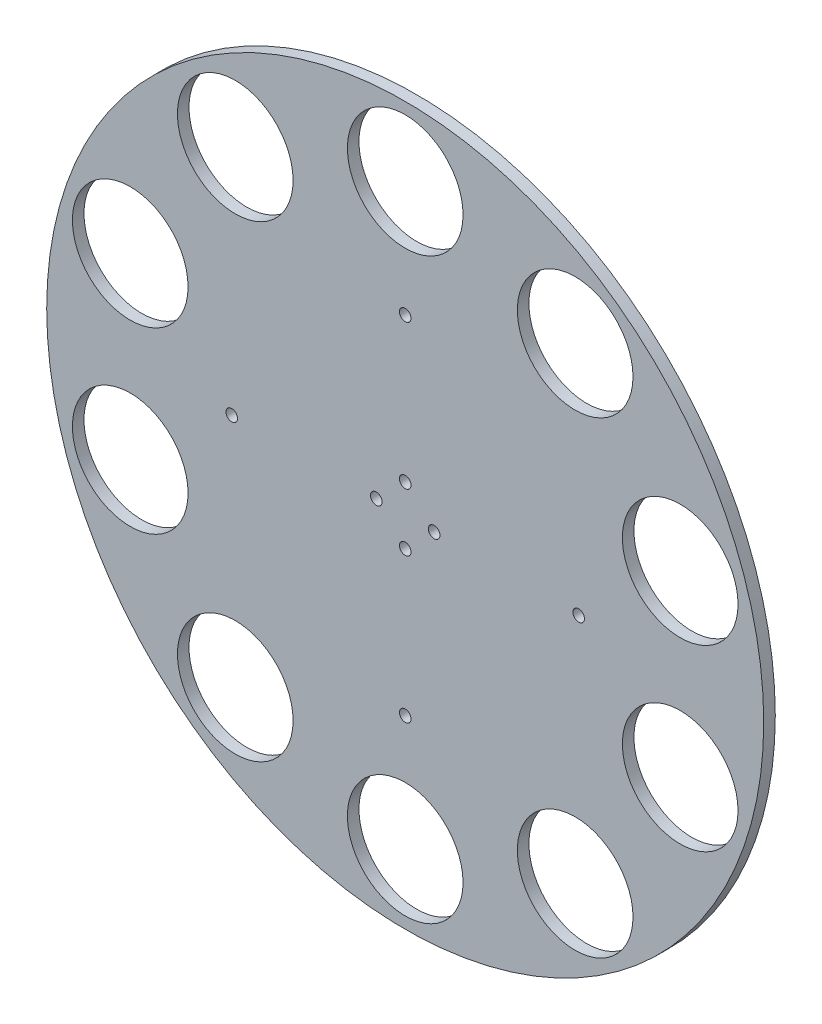
ISO-10303-21;
HEADER;
FILE_DESCRIPTION(('STEP AP214'),'2;1');
FILE_NAME('part.step','',(''),(''),'','','');
FILE_SCHEMA(('AUTOMOTIVE_DESIGN { 1 0 10303 214 1 1 1 1 }'));
ENDSEC;
DATA;
#1=APPLICATION_CONTEXT('core data for automotive mechanical design processes');
#2=APPLICATION_PROTOCOL_DEFINITION('international standard','automotive_design',2000,#1);
#3=PRODUCT_CONTEXT('',#1,'mechanical');
#4=PRODUCT('Part','Part','',(#3));
#5=PRODUCT_RELATED_PRODUCT_CATEGORY('part','',(#4));
#6=PRODUCT_DEFINITION_FORMATION('','',#4);
#7=PRODUCT_DEFINITION_CONTEXT('part definition',#1,'design');
#8=PRODUCT_DEFINITION('design','',#6,#7);
#9=PRODUCT_DEFINITION_SHAPE('','',#8);
#10=(LENGTH_UNIT() NAMED_UNIT(*) SI_UNIT(.MILLI.,.METRE.));
#11=(NAMED_UNIT(*) PLANE_ANGLE_UNIT() SI_UNIT($,.RADIAN.));
#12=(NAMED_UNIT(*) SI_UNIT($,.STERADIAN.) SOLID_ANGLE_UNIT());
#13=UNCERTAINTY_MEASURE_WITH_UNIT(LENGTH_MEASURE(1.E-05),#10,'distance_accuracy_value','');
#14=(GEOMETRIC_REPRESENTATION_CONTEXT(3) GLOBAL_UNCERTAINTY_ASSIGNED_CONTEXT((#13)) GLOBAL_UNIT_ASSIGNED_CONTEXT((#10,
#11,#12)) REPRESENTATION_CONTEXT('',''));
#15=CARTESIAN_POINT('',(0.,0.,0.));
#16=DIRECTION('',(0.,0.,1.));
#17=DIRECTION('',(1.,0.,0.));
#18=AXIS2_PLACEMENT_3D('',#15,#16,#17);
#19=CARTESIAN_POINT('',(0.,0.,0.));
#20=DIRECTION('',(0.,0.,1.));
#21=DIRECTION('',(1.,0.,0.));
#22=AXIS2_PLACEMENT_3D('',#19,#20,#21);
#23=PLANE('',#22);
#24=CARTESIAN_POINT('',(12.5,0.,0.));
#25=DIRECTION('',(0.,0.,-1.));
#26=DIRECTION('',(-1.,0.,0.));
#27=AXIS2_PLACEMENT_3D('',#24,#25,#26);
#28=CIRCLE('',#27,2.5);
#29=CARTESIAN_POINT('',(15.,0.,0.));
#30=VERTEX_POINT('',#29);
#31=EDGE_CURVE('E194',#30,#30,#28,.T.);
#32=ORIENTED_EDGE('',*,*,#31,.F.);
#33=EDGE_LOOP('',(#32));
#34=FACE_BOUND('',#33,.T.);
#35=CARTESIAN_POINT('',(0.,-12.5,0.));
#36=DIRECTION('',(0.,0.,-1.));
#37=DIRECTION('',(-1.,0.,0.));
#38=AXIS2_PLACEMENT_3D('',#35,#36,#37);
#39=CIRCLE('',#38,2.5);
#40=CARTESIAN_POINT('',(2.5,-12.5,0.));
#41=VERTEX_POINT('',#40);
#42=EDGE_CURVE('E217',#41,#41,#39,.T.);
#43=ORIENTED_EDGE('',*,*,#42,.F.);
#44=EDGE_LOOP('',(#43));
#45=FACE_BOUND('',#44,.T.);
#46=CARTESIAN_POINT('',(-12.5,0.,0.));
#47=DIRECTION('',(0.,0.,-1.));
#48=DIRECTION('',(-1.,0.,0.));
#49=AXIS2_PLACEMENT_3D('',#46,#47,#48);
#50=CIRCLE('',#49,2.5);
#51=CARTESIAN_POINT('',(-10.,0.,0.));
#52=VERTEX_POINT('',#51);
#53=EDGE_CURVE('E228',#52,#52,#50,.T.);
#54=ORIENTED_EDGE('',*,*,#53,.F.);
#55=EDGE_LOOP('',(#54));
#56=FACE_BOUND('',#55,.T.);
#57=CARTESIAN_POINT('',(0.,12.5,0.));
#58=DIRECTION('',(0.,0.,-1.));
#59=DIRECTION('',(-1.,0.,0.));
#60=AXIS2_PLACEMENT_3D('',#57,#58,#59);
#61=CIRCLE('',#60,2.5);
#62=CARTESIAN_POINT('',(2.5,12.5,0.));
#63=VERTEX_POINT('',#62);
#64=EDGE_CURVE('E239',#63,#63,#61,.T.);
#65=ORIENTED_EDGE('',*,*,#64,.F.);
#66=EDGE_LOOP('',(#65));
#67=FACE_BOUND('',#66,.T.);
#68=CARTESIAN_POINT('',(-118.882064536894,-38.6271242968684,0.));
#69=DIRECTION('',(0.,0.,-1.));
#70=DIRECTION('',(-1.,0.,0.));
#71=AXIS2_PLACEMENT_3D('',#68,#69,#70);
#72=CIRCLE('',#71,25.);
#73=CARTESIAN_POINT('',(-93.8820645368942,-38.6271242968684,0.));
#74=VERTEX_POINT('',#73);
#75=EDGE_CURVE('E249',#74,#74,#72,.T.);
#76=ORIENTED_EDGE('',*,*,#75,.F.);
#77=EDGE_LOOP('',(#76));
#78=FACE_BOUND('',#77,.T.);
#79=CARTESIAN_POINT('',(75.,0.,0.));
#80=DIRECTION('',(0.,0.,-1.));
#81=DIRECTION('',(-1.,0.,0.));
#82=AXIS2_PLACEMENT_3D('',#79,#80,#81);
#83=CIRCLE('',#82,2.5);
#84=CARTESIAN_POINT('',(77.5,0.,0.));
#85=VERTEX_POINT('',#84);
#86=EDGE_CURVE('E264',#85,#85,#83,.T.);
#87=ORIENTED_EDGE('',*,*,#86,.F.);
#88=EDGE_LOOP('',(#87));
#89=FACE_BOUND('',#88,.T.);
#90=CARTESIAN_POINT('',(0.,-75.,0.));
#91=DIRECTION('',(0.,0.,-1.));
#92=DIRECTION('',(-1.,0.,0.));
#93=AXIS2_PLACEMENT_3D('',#90,#91,#92);
#94=CIRCLE('',#93,2.5);
#95=CARTESIAN_POINT('',(2.5,-75.,0.));
#96=VERTEX_POINT('',#95);
#97=EDGE_CURVE('E277',#96,#96,#94,.T.);
#98=ORIENTED_EDGE('',*,*,#97,.F.);
#99=EDGE_LOOP('',(#98));
#100=FACE_BOUND('',#99,.T.);
#101=CARTESIAN_POINT('',(-75.,0.,0.));
#102=DIRECTION('',(0.,0.,-1.));
#103=DIRECTION('',(-1.,0.,0.));
#104=AXIS2_PLACEMENT_3D('',#101,#102,#103);
#105=CIRCLE('',#104,2.5);
#106=CARTESIAN_POINT('',(-72.5,0.,0.));
#107=VERTEX_POINT('',#106);
#108=EDGE_CURVE('E290',#107,#107,#105,.T.);
#109=ORIENTED_EDGE('',*,*,#108,.F.);
#110=EDGE_LOOP('',(#109));
#111=FACE_BOUND('',#110,.T.);
#112=CARTESIAN_POINT('',(0.,75.,0.));
#113=DIRECTION('',(0.,0.,-1.));
#114=DIRECTION('',(-1.,0.,0.));
#115=AXIS2_PLACEMENT_3D('',#112,#113,#114);
#116=CIRCLE('',#115,2.5);
#117=CARTESIAN_POINT('',(2.5,75.,0.));
#118=VERTEX_POINT('',#117);
#119=EDGE_CURVE('E297',#118,#118,#116,.T.);
#120=ORIENTED_EDGE('',*,*,#119,.F.);
#121=EDGE_LOOP('',(#120));
#122=FACE_BOUND('',#121,.T.);
#123=CARTESIAN_POINT('',(-73.4731565365592,-101.127124296868,0.));
#124=DIRECTION('',(0.,0.,-1.));
#125=DIRECTION('',(-1.,0.,0.));
#126=AXIS2_PLACEMENT_3D('',#123,#124,#125);
#127=CIRCLE('',#126,25.);
#128=CARTESIAN_POINT('',(-48.4731565365592,-101.127124296868,0.));
#129=VERTEX_POINT('',#128);
#130=EDGE_CURVE('E310',#129,#129,#127,.T.);
#131=ORIENTED_EDGE('',*,*,#130,.F.);
#132=EDGE_LOOP('',(#131));
#133=FACE_BOUND('',#132,.T.);
#134=CARTESIAN_POINT('',(-118.882064536894,38.6271242968684,0.));
#135=DIRECTION('',(0.,0.,-1.));
#136=DIRECTION('',(-1.,0.,0.));
#137=AXIS2_PLACEMENT_3D('',#134,#135,#136);
#138=CIRCLE('',#137,25.);
#139=CARTESIAN_POINT('',(-93.8820645368942,38.6271242968685,0.));
#140=VERTEX_POINT('',#139);
#141=EDGE_CURVE('E319',#140,#140,#138,.T.);
#142=ORIENTED_EDGE('',*,*,#141,.F.);
#143=EDGE_LOOP('',(#142));
#144=FACE_BOUND('',#143,.T.);
#145=CARTESIAN_POINT('',(-73.4731565365591,101.127124296868,0.));
#146=DIRECTION('',(0.,0.,-1.));
#147=DIRECTION('',(-1.,0.,0.));
#148=AXIS2_PLACEMENT_3D('',#145,#146,#147);
#149=CIRCLE('',#148,25.);
#150=CARTESIAN_POINT('',(-48.4731565365591,101.127124296868,0.));
#151=VERTEX_POINT('',#150);
#152=EDGE_CURVE('E332',#151,#151,#149,.T.);
#153=ORIENTED_EDGE('',*,*,#152,.F.);
#154=EDGE_LOOP('',(#153));
#155=FACE_BOUND('',#154,.T.);
#156=CARTESIAN_POINT('',(0.,125.,0.));
#157=DIRECTION('',(0.,0.,-1.));
#158=DIRECTION('',(-1.,0.,0.));
#159=AXIS2_PLACEMENT_3D('',#156,#157,#158);
#160=CIRCLE('',#159,25.);
#161=CARTESIAN_POINT('',(25.,125.,0.));
#162=VERTEX_POINT('',#161);
#163=EDGE_CURVE('E345',#162,#162,#160,.T.);
#164=ORIENTED_EDGE('',*,*,#163,.F.);
#165=EDGE_LOOP('',(#164));
#166=FACE_BOUND('',#165,.T.);
#167=CARTESIAN_POINT('',(73.4731565365591,101.127124296868,0.));
#168=DIRECTION('',(0.,0.,-1.));
#169=DIRECTION('',(-1.,0.,0.));
#170=AXIS2_PLACEMENT_3D('',#167,#168,#169);
#171=CIRCLE('',#170,25.);
#172=CARTESIAN_POINT('',(98.4731565365591,101.127124296868,0.));
#173=VERTEX_POINT('',#172);
#174=EDGE_CURVE('E359',#173,#173,#171,.T.);
#175=ORIENTED_EDGE('',*,*,#174,.F.);
#176=EDGE_LOOP('',(#175));
#177=FACE_BOUND('',#176,.T.);
#178=CARTESIAN_POINT('',(118.882064536894,38.6271242968684,0.));
#179=DIRECTION('',(0.,0.,-1.));
#180=DIRECTION('',(-1.,0.,0.));
#181=AXIS2_PLACEMENT_3D('',#178,#179,#180);
#182=CIRCLE('',#181,25.);
#183=CARTESIAN_POINT('',(143.882064536894,38.6271242968684,0.));
#184=VERTEX_POINT('',#183);
#185=EDGE_CURVE('E369',#184,#184,#182,.T.);
#186=ORIENTED_EDGE('',*,*,#185,.F.);
#187=EDGE_LOOP('',(#186));
#188=FACE_BOUND('',#187,.T.);
#189=CARTESIAN_POINT('',(118.882064536894,-38.6271242968684,0.));
#190=DIRECTION('',(0.,0.,-1.));
#191=DIRECTION('',(-1.,0.,0.));
#192=AXIS2_PLACEMENT_3D('',#189,#190,#191);
#193=CIRCLE('',#192,25.);
#194=CARTESIAN_POINT('',(143.882064536894,-38.6271242968684,0.));
#195=VERTEX_POINT('',#194);
#196=EDGE_CURVE('E260',#195,#195,#193,.T.);
#197=ORIENTED_EDGE('',*,*,#196,.F.);
#198=EDGE_LOOP('',(#197));
#199=FACE_BOUND('',#198,.T.);
#200=CARTESIAN_POINT('',(73.4731565365591,-101.127124296868,0.));
#201=DIRECTION('',(0.,0.,-1.));
#202=DIRECTION('',(-1.,0.,0.));
#203=AXIS2_PLACEMENT_3D('',#200,#201,#202);
#204=CIRCLE('',#203,25.);
#205=CARTESIAN_POINT('',(98.4731565365591,-101.127124296868,0.));
#206=VERTEX_POINT('',#205);
#207=EDGE_CURVE('E202',#206,#206,#204,.T.);
#208=ORIENTED_EDGE('',*,*,#207,.F.);
#209=EDGE_LOOP('',(#208));
#210=FACE_BOUND('',#209,.T.);
#211=CARTESIAN_POINT('',(0.,-125.,0.));
#212=DIRECTION('',(0.,0.,-1.));
#213=DIRECTION('',(-1.,0.,0.));
#214=AXIS2_PLACEMENT_3D('',#211,#212,#213);
#215=CIRCLE('',#214,25.);
#216=CARTESIAN_POINT('',(25.,-125.,0.));
#217=VERTEX_POINT('',#216);
#218=EDGE_CURVE('E343',#217,#217,#215,.T.);
#219=ORIENTED_EDGE('',*,*,#218,.F.);
#220=EDGE_LOOP('',(#219));
#221=FACE_BOUND('',#220,.T.);
#222=CARTESIAN_POINT('',(0.,0.,0.));
#223=DIRECTION('',(0.,0.,1.));
#224=DIRECTION('',(1.,0.,0.));
#225=AXIS2_PLACEMENT_3D('',#222,#223,#224);
#226=CIRCLE('',#225,155.);
#227=CARTESIAN_POINT('',(-155.,0.,0.));
#228=VERTEX_POINT('',#227);
#229=EDGE_CURVE('E11',#228,#228,#226,.T.);
#230=ORIENTED_EDGE('',*,*,#229,.F.);
#231=EDGE_LOOP('',(#230));
#232=FACE_BOUND('',#231,.T.);
#233=ADVANCED_FACE('F17',(#34,#45,#56,#67,#78,#89,#100,#111,#122,#133,#144,#155,#166,#177,#188,
#199,#210,#221,#232),#23,.F.);
#234=CARTESIAN_POINT('',(0.,0.,5.));
#235=DIRECTION('',(0.,0.,1.));
#236=DIRECTION('',(1.,0.,0.));
#237=AXIS2_PLACEMENT_3D('',#234,#235,#236);
#238=PLANE('',#237);
#239=CARTESIAN_POINT('',(12.5,0.,5.));
#240=DIRECTION('',(0.,0.,-1.));
#241=DIRECTION('',(-1.,0.,0.));
#242=AXIS2_PLACEMENT_3D('',#239,#240,#241);
#243=CIRCLE('',#242,2.5);
#244=CARTESIAN_POINT('',(15.,0.,5.));
#245=VERTEX_POINT('',#244);
#246=EDGE_CURVE('E192',#245,#245,#243,.T.);
#247=ORIENTED_EDGE('',*,*,#246,.T.);
#248=EDGE_LOOP('',(#247));
#249=FACE_BOUND('',#248,.T.);
#250=CARTESIAN_POINT('',(0.,-12.5,5.));
#251=DIRECTION('',(0.,0.,-1.));
#252=DIRECTION('',(-1.,0.,0.));
#253=AXIS2_PLACEMENT_3D('',#250,#251,#252);
#254=CIRCLE('',#253,2.5);
#255=CARTESIAN_POINT('',(2.5,-12.5,5.));
#256=VERTEX_POINT('',#255);
#257=EDGE_CURVE('E209',#256,#256,#254,.T.);
#258=ORIENTED_EDGE('',*,*,#257,.T.);
#259=EDGE_LOOP('',(#258));
#260=FACE_BOUND('',#259,.T.);
#261=CARTESIAN_POINT('',(-12.5,0.,5.));
#262=DIRECTION('',(0.,0.,-1.));
#263=DIRECTION('',(-1.,0.,0.));
#264=AXIS2_PLACEMENT_3D('',#261,#262,#263);
#265=CIRCLE('',#264,2.5);
#266=CARTESIAN_POINT('',(-10.,0.,5.));
#267=VERTEX_POINT('',#266);
#268=EDGE_CURVE('E222',#267,#267,#265,.T.);
#269=ORIENTED_EDGE('',*,*,#268,.T.);
#270=EDGE_LOOP('',(#269));
#271=FACE_BOUND('',#270,.T.);
#272=CARTESIAN_POINT('',(0.,12.5,5.));
#273=DIRECTION('',(0.,0.,-1.));
#274=DIRECTION('',(-1.,0.,0.));
#275=AXIS2_PLACEMENT_3D('',#272,#273,#274);
#276=CIRCLE('',#275,2.5);
#277=CARTESIAN_POINT('',(2.5,12.5,5.));
#278=VERTEX_POINT('',#277);
#279=EDGE_CURVE('E235',#278,#278,#276,.T.);
#280=ORIENTED_EDGE('',*,*,#279,.T.);
#281=EDGE_LOOP('',(#280));
#282=FACE_BOUND('',#281,.T.);
#283=CARTESIAN_POINT('',(-118.882064536894,-38.6271242968684,5.));
#284=DIRECTION('',(0.,0.,-1.));
#285=DIRECTION('',(-1.,0.,0.));
#286=AXIS2_PLACEMENT_3D('',#283,#284,#285);
#287=CIRCLE('',#286,25.);
#288=CARTESIAN_POINT('',(-93.8820645368942,-38.6271242968684,5.));
#289=VERTEX_POINT('',#288);
#290=EDGE_CURVE('E242',#289,#289,#287,.T.);
#291=ORIENTED_EDGE('',*,*,#290,.T.);
#292=EDGE_LOOP('',(#291));
#293=FACE_BOUND('',#292,.T.);
#294=CARTESIAN_POINT('',(75.,0.,5.));
#295=DIRECTION('',(0.,0.,-1.));
#296=DIRECTION('',(-1.,0.,0.));
#297=AXIS2_PLACEMENT_3D('',#294,#295,#296);
#298=CIRCLE('',#297,2.5);
#299=CARTESIAN_POINT('',(77.5,0.,5.));
#300=VERTEX_POINT('',#299);
#301=EDGE_CURVE('E253',#300,#300,#298,.T.);
#302=ORIENTED_EDGE('',*,*,#301,.T.);
#303=EDGE_LOOP('',(#302));
#304=FACE_BOUND('',#303,.T.);
#305=CARTESIAN_POINT('',(0.,-75.,5.));
#306=DIRECTION('',(0.,0.,-1.));
#307=DIRECTION('',(-1.,0.,0.));
#308=AXIS2_PLACEMENT_3D('',#305,#306,#307);
#309=CIRCLE('',#308,2.5);
#310=CARTESIAN_POINT('',(2.5,-75.,5.));
#311=VERTEX_POINT('',#310);
#312=EDGE_CURVE('E268',#311,#311,#309,.T.);
#313=ORIENTED_EDGE('',*,*,#312,.T.);
#314=EDGE_LOOP('',(#313));
#315=FACE_BOUND('',#314,.T.);
#316=CARTESIAN_POINT('',(-75.,0.,5.));
#317=DIRECTION('',(0.,0.,-1.));
#318=DIRECTION('',(-1.,0.,0.));
#319=AXIS2_PLACEMENT_3D('',#316,#317,#318);
#320=CIRCLE('',#319,2.5);
#321=CARTESIAN_POINT('',(-72.5,0.,5.));
#322=VERTEX_POINT('',#321);
#323=EDGE_CURVE('E276',#322,#322,#320,.T.);
#324=ORIENTED_EDGE('',*,*,#323,.T.);
#325=EDGE_LOOP('',(#324));
#326=FACE_BOUND('',#325,.T.);
#327=CARTESIAN_POINT('',(0.,75.,5.));
#328=DIRECTION('',(0.,0.,-1.));
#329=DIRECTION('',(-1.,0.,0.));
#330=AXIS2_PLACEMENT_3D('',#327,#328,#329);
#331=CIRCLE('',#330,2.5);
#332=CARTESIAN_POINT('',(2.5,75.,5.));
#333=VERTEX_POINT('',#332);
#334=EDGE_CURVE('E289',#333,#333,#331,.T.);
#335=ORIENTED_EDGE('',*,*,#334,.T.);
#336=EDGE_LOOP('',(#335));
#337=FACE_BOUND('',#336,.T.);
#338=CARTESIAN_POINT('',(-73.4731565365592,-101.127124296868,5.));
#339=DIRECTION('',(0.,0.,-1.));
#340=DIRECTION('',(-1.,0.,0.));
#341=AXIS2_PLACEMENT_3D('',#338,#339,#340);
#342=CIRCLE('',#341,25.);
#343=CARTESIAN_POINT('',(-48.4731565365592,-101.127124296868,5.));
#344=VERTEX_POINT('',#343);
#345=EDGE_CURVE('E302',#344,#344,#342,.T.);
#346=ORIENTED_EDGE('',*,*,#345,.T.);
#347=EDGE_LOOP('',(#346));
#348=FACE_BOUND('',#347,.T.);
#349=CARTESIAN_POINT('',(-118.882064536894,38.6271242968684,5.));
#350=DIRECTION('',(0.,0.,-1.));
#351=DIRECTION('',(-1.,0.,0.));
#352=AXIS2_PLACEMENT_3D('',#349,#350,#351);
#353=CIRCLE('',#352,25.);
#354=CARTESIAN_POINT('',(-93.8820645368942,38.6271242968685,5.));
#355=VERTEX_POINT('',#354);
#356=EDGE_CURVE('E315',#355,#355,#353,.T.);
#357=ORIENTED_EDGE('',*,*,#356,.T.);
#358=EDGE_LOOP('',(#357));
#359=FACE_BOUND('',#358,.T.);
#360=CARTESIAN_POINT('',(-73.4731565365591,101.127124296868,5.));
#361=DIRECTION('',(0.,0.,-1.));
#362=DIRECTION('',(-1.,0.,0.));
#363=AXIS2_PLACEMENT_3D('',#360,#361,#362);
#364=CIRCLE('',#363,25.);
#365=CARTESIAN_POINT('',(-48.4731565365591,101.127124296868,5.));
#366=VERTEX_POINT('',#365);
#367=EDGE_CURVE('E323',#366,#366,#364,.T.);
#368=ORIENTED_EDGE('',*,*,#367,.T.);
#369=EDGE_LOOP('',(#368));
#370=FACE_BOUND('',#369,.T.);
#371=CARTESIAN_POINT('',(0.,125.,5.));
#372=DIRECTION('',(0.,0.,-1.));
#373=DIRECTION('',(-1.,0.,0.));
#374=AXIS2_PLACEMENT_3D('',#371,#372,#373);
#375=CIRCLE('',#374,25.);
#376=CARTESIAN_POINT('',(25.,125.,5.));
#377=VERTEX_POINT('',#376);
#378=EDGE_CURVE('E331',#377,#377,#375,.T.);
#379=ORIENTED_EDGE('',*,*,#378,.T.);
#380=EDGE_LOOP('',(#379));
#381=FACE_BOUND('',#380,.T.);
#382=CARTESIAN_POINT('',(73.4731565365591,101.127124296868,5.));
#383=DIRECTION('',(0.,0.,-1.));
#384=DIRECTION('',(-1.,0.,0.));
#385=AXIS2_PLACEMENT_3D('',#382,#383,#384);
#386=CIRCLE('',#385,25.);
#387=CARTESIAN_POINT('',(98.4731565365591,101.127124296868,5.));
#388=VERTEX_POINT('',#387);
#389=EDGE_CURVE('E349',#388,#388,#386,.T.);
#390=ORIENTED_EDGE('',*,*,#389,.T.);
#391=EDGE_LOOP('',(#390));
#392=FACE_BOUND('',#391,.T.);
#393=CARTESIAN_POINT('',(118.882064536894,38.6271242968684,5.));
#394=DIRECTION('',(0.,0.,-1.));
#395=DIRECTION('',(-1.,0.,0.));
#396=AXIS2_PLACEMENT_3D('',#393,#394,#395);
#397=CIRCLE('',#396,25.);
#398=CARTESIAN_POINT('',(143.882064536894,38.6271242968684,5.));
#399=VERTEX_POINT('',#398);
#400=EDGE_CURVE('E363',#399,#399,#397,.T.);
#401=ORIENTED_EDGE('',*,*,#400,.T.);
#402=EDGE_LOOP('',(#401));
#403=FACE_BOUND('',#402,.T.);
#404=CARTESIAN_POINT('',(118.882064536894,-38.6271242968684,5.));
#405=DIRECTION('',(0.,0.,-1.));
#406=DIRECTION('',(-1.,0.,0.));
#407=AXIS2_PLACEMENT_3D('',#404,#405,#406);
#408=CIRCLE('',#407,25.);
#409=CARTESIAN_POINT('',(143.882064536894,-38.6271242968684,5.));
#410=VERTEX_POINT('',#409);
#411=EDGE_CURVE('E375',#410,#410,#408,.T.);
#412=ORIENTED_EDGE('',*,*,#411,.T.);
#413=EDGE_LOOP('',(#412));
#414=FACE_BOUND('',#413,.T.);
#415=CARTESIAN_POINT('',(73.4731565365591,-101.127124296868,5.));
#416=DIRECTION('',(0.,0.,-1.));
#417=DIRECTION('',(-1.,0.,0.));
#418=AXIS2_PLACEMENT_3D('',#415,#416,#417);
#419=CIRCLE('',#418,25.);
#420=CARTESIAN_POINT('',(98.4731565365591,-101.127124296868,5.));
#421=VERTEX_POINT('',#420);
#422=EDGE_CURVE('E252',#421,#421,#419,.T.);
#423=ORIENTED_EDGE('',*,*,#422,.T.);
#424=EDGE_LOOP('',(#423));
#425=FACE_BOUND('',#424,.T.);
#426=CARTESIAN_POINT('',(0.,-125.,5.));
#427=DIRECTION('',(0.,0.,-1.));
#428=DIRECTION('',(-1.,0.,0.));
#429=AXIS2_PLACEMENT_3D('',#426,#427,#428);
#430=CIRCLE('',#429,25.);
#431=CARTESIAN_POINT('',(25.,-125.,5.));
#432=VERTEX_POINT('',#431);
#433=EDGE_CURVE('E384',#432,#432,#430,.T.);
#434=ORIENTED_EDGE('',*,*,#433,.T.);
#435=EDGE_LOOP('',(#434));
#436=FACE_BOUND('',#435,.T.);
#437=CARTESIAN_POINT('',(0.,0.,5.));
#438=DIRECTION('',(0.,0.,1.));
#439=DIRECTION('',(1.,0.,0.));
#440=AXIS2_PLACEMENT_3D('',#437,#438,#439);
#441=CIRCLE('',#440,155.);
#442=CARTESIAN_POINT('',(-155.,0.,5.));
#443=VERTEX_POINT('',#442);
#444=EDGE_CURVE('E350',#443,#443,#441,.T.);
#445=ORIENTED_EDGE('',*,*,#444,.T.);
#446=EDGE_LOOP('',(#445));
#447=FACE_BOUND('',#446,.T.);
#448=ADVANCED_FACE('F197',(#249,#260,#271,#282,#293,#304,#315,#326,#337,#348,#359,#370,#381,
#392,#403,#414,#425,#436,#447),#238,.T.);
#449=CARTESIAN_POINT('',(0.,0.,0.));
#450=DIRECTION('',(0.,0.,1.));
#451=DIRECTION('',(1.,0.,0.));
#452=AXIS2_PLACEMENT_3D('',#449,#450,#451);
#453=CYLINDRICAL_SURFACE('',#452,155.);
#454=ORIENTED_EDGE('',*,*,#444,.F.);
#455=DIRECTION('',(0.,0.,-1.));
#456=VECTOR('',#455,1.);
#457=CARTESIAN_POINT('',(-155.,0.,0.));
#458=LINE('',#457,#456);
#459=EDGE_CURVE('E25',#443,#228,#458,.T.);
#460=ORIENTED_EDGE('',*,*,#459,.T.);
#461=ORIENTED_EDGE('',*,*,#229,.T.);
#462=ORIENTED_EDGE('',*,*,#459,.F.);
#463=EDGE_LOOP('',(#454,#460,#461,#462));
#464=FACE_BOUND('',#463,.T.);
#465=ADVANCED_FACE('F396',(#464),#453,.T.);
#466=CARTESIAN_POINT('',(0.,-125.,0.));
#467=DIRECTION('',(0.,0.,1.));
#468=DIRECTION('',(-1.,0.,0.));
#469=AXIS2_PLACEMENT_3D('',#466,#467,#468);
#470=CYLINDRICAL_SURFACE('',#469,25.);
#471=ORIENTED_EDGE('',*,*,#433,.F.);
#472=DIRECTION('',(0.,0.,-1.));
#473=VECTOR('',#472,1.);
#474=CARTESIAN_POINT('',(25.,-125.,0.));
#475=LINE('',#474,#473);
#476=EDGE_CURVE('E346',#432,#217,#475,.T.);
#477=ORIENTED_EDGE('',*,*,#476,.T.);
#478=ORIENTED_EDGE('',*,*,#218,.T.);
#479=ORIENTED_EDGE('',*,*,#476,.F.);
#480=EDGE_LOOP('',(#471,#477,#478,#479));
#481=FACE_BOUND('',#480,.T.);
#482=ADVANCED_FACE('F402',(#481),#470,.F.);
#483=CARTESIAN_POINT('',(73.4731565365591,-101.127124296868,0.));
#484=DIRECTION('',(0.,0.,1.));
#485=DIRECTION('',(-1.,0.,0.));
#486=AXIS2_PLACEMENT_3D('',#483,#484,#485);
#487=CYLINDRICAL_SURFACE('',#486,25.);
#488=ORIENTED_EDGE('',*,*,#422,.F.);
#489=DIRECTION('',(0.,0.,-1.));
#490=VECTOR('',#489,1.);
#491=CARTESIAN_POINT('',(98.4731565365591,-101.127124296868,0.));
#492=LINE('',#491,#490);
#493=EDGE_CURVE('E258',#421,#206,#492,.T.);
#494=ORIENTED_EDGE('',*,*,#493,.T.);
#495=ORIENTED_EDGE('',*,*,#207,.T.);
#496=ORIENTED_EDGE('',*,*,#493,.F.);
#497=EDGE_LOOP('',(#488,#494,#495,#496));
#498=FACE_BOUND('',#497,.T.);
#499=ADVANCED_FACE('F409',(#498),#487,.F.);
#500=CARTESIAN_POINT('',(118.882064536894,-38.6271242968684,0.));
#501=DIRECTION('',(0.,0.,1.));
#502=DIRECTION('',(-1.,0.,0.));
#503=AXIS2_PLACEMENT_3D('',#500,#501,#502);
#504=CYLINDRICAL_SURFACE('',#503,25.);
#505=ORIENTED_EDGE('',*,*,#411,.F.);
#506=DIRECTION('',(0.,0.,-1.));
#507=VECTOR('',#506,1.);
#508=CARTESIAN_POINT('',(143.882064536894,-38.6271242968684,0.));
#509=LINE('',#508,#507);
#510=EDGE_CURVE('E376',#410,#195,#509,.T.);
#511=ORIENTED_EDGE('',*,*,#510,.T.);
#512=ORIENTED_EDGE('',*,*,#196,.T.);
#513=ORIENTED_EDGE('',*,*,#510,.F.);
#514=EDGE_LOOP('',(#505,#511,#512,#513));
#515=FACE_BOUND('',#514,.T.);
#516=ADVANCED_FACE('F411',(#515),#504,.F.);
#517=CARTESIAN_POINT('',(118.882064536894,38.6271242968684,0.));
#518=DIRECTION('',(0.,0.,1.));
#519=DIRECTION('',(-1.,0.,0.));
#520=AXIS2_PLACEMENT_3D('',#517,#518,#519);
#521=CYLINDRICAL_SURFACE('',#520,25.);
#522=ORIENTED_EDGE('',*,*,#400,.F.);
#523=DIRECTION('',(0.,0.,-1.));
#524=VECTOR('',#523,1.);
#525=CARTESIAN_POINT('',(143.882064536894,38.6271242968684,0.));
#526=LINE('',#525,#524);
#527=EDGE_CURVE('E364',#399,#184,#526,.T.);
#528=ORIENTED_EDGE('',*,*,#527,.T.);
#529=ORIENTED_EDGE('',*,*,#185,.T.);
#530=ORIENTED_EDGE('',*,*,#527,.F.);
#531=EDGE_LOOP('',(#522,#528,#529,#530));
#532=FACE_BOUND('',#531,.T.);
#533=ADVANCED_FACE('F416',(#532),#521,.F.);
#534=CARTESIAN_POINT('',(73.4731565365591,101.127124296868,0.));
#535=DIRECTION('',(0.,0.,1.));
#536=DIRECTION('',(-1.,0.,0.));
#537=AXIS2_PLACEMENT_3D('',#534,#535,#536);
#538=CYLINDRICAL_SURFACE('',#537,25.);
#539=ORIENTED_EDGE('',*,*,#389,.F.);
#540=DIRECTION('',(0.,0.,-1.));
#541=VECTOR('',#540,1.);
#542=CARTESIAN_POINT('',(98.4731565365591,101.127124296868,0.));
#543=LINE('',#542,#541);
#544=EDGE_CURVE('E353',#388,#173,#543,.T.);
#545=ORIENTED_EDGE('',*,*,#544,.T.);
#546=ORIENTED_EDGE('',*,*,#174,.T.);
#547=ORIENTED_EDGE('',*,*,#544,.F.);
#548=EDGE_LOOP('',(#539,#545,#546,#547));
#549=FACE_BOUND('',#548,.T.);
#550=ADVANCED_FACE('F425',(#549),#538,.F.);
#551=CARTESIAN_POINT('',(0.,125.,0.));
#552=DIRECTION('',(0.,0.,1.));
#553=DIRECTION('',(-1.,0.,0.));
#554=AXIS2_PLACEMENT_3D('',#551,#552,#553);
#555=CYLINDRICAL_SURFACE('',#554,25.);
#556=ORIENTED_EDGE('',*,*,#378,.F.);
#557=DIRECTION('',(0.,0.,-1.));
#558=VECTOR('',#557,1.);
#559=CARTESIAN_POINT('',(25.,125.,0.));
#560=LINE('',#559,#558);
#561=EDGE_CURVE('E339',#377,#162,#560,.T.);
#562=ORIENTED_EDGE('',*,*,#561,.T.);
#563=ORIENTED_EDGE('',*,*,#163,.T.);
#564=ORIENTED_EDGE('',*,*,#561,.F.);
#565=EDGE_LOOP('',(#556,#562,#563,#564));
#566=FACE_BOUND('',#565,.T.);
#567=ADVANCED_FACE('F428',(#566),#555,.F.);
#568=CARTESIAN_POINT('',(-73.4731565365591,101.127124296868,0.));
#569=DIRECTION('',(0.,0.,1.));
#570=DIRECTION('',(-1.,0.,0.));
#571=AXIS2_PLACEMENT_3D('',#568,#569,#570);
#572=CYLINDRICAL_SURFACE('',#571,25.);
#573=ORIENTED_EDGE('',*,*,#367,.F.);
#574=DIRECTION('',(0.,0.,-1.));
#575=VECTOR('',#574,1.);
#576=CARTESIAN_POINT('',(-48.4731565365591,101.127124296868,0.));
#577=LINE('',#576,#575);
#578=EDGE_CURVE('E330',#366,#151,#577,.T.);
#579=ORIENTED_EDGE('',*,*,#578,.T.);
#580=ORIENTED_EDGE('',*,*,#152,.T.);
#581=ORIENTED_EDGE('',*,*,#578,.F.);
#582=EDGE_LOOP('',(#573,#579,#580,#581));
#583=FACE_BOUND('',#582,.T.);
#584=ADVANCED_FACE('F424',(#583),#572,.F.);
#585=CARTESIAN_POINT('',(-118.882064536894,38.6271242968684,0.));
#586=DIRECTION('',(0.,0.,1.));
#587=DIRECTION('',(-1.,0.,0.));
#588=AXIS2_PLACEMENT_3D('',#585,#586,#587);
#589=CYLINDRICAL_SURFACE('',#588,25.);
#590=ORIENTED_EDGE('',*,*,#356,.F.);
#591=DIRECTION('',(0.,0.,-1.));
#592=VECTOR('',#591,1.);
#593=CARTESIAN_POINT('',(-93.8820645368942,38.6271242968685,0.));
#594=LINE('',#593,#592);
#595=EDGE_CURVE('E316',#355,#140,#594,.T.);
#596=ORIENTED_EDGE('',*,*,#595,.T.);
#597=ORIENTED_EDGE('',*,*,#141,.T.);
#598=ORIENTED_EDGE('',*,*,#595,.F.);
#599=EDGE_LOOP('',(#590,#596,#597,#598));
#600=FACE_BOUND('',#599,.T.);
#601=ADVANCED_FACE('F430',(#600),#589,.F.);
#602=CARTESIAN_POINT('',(-73.4731565365592,-101.127124296868,0.));
#603=DIRECTION('',(0.,0.,1.));
#604=DIRECTION('',(-1.,0.,0.));
#605=AXIS2_PLACEMENT_3D('',#602,#603,#604);
#606=CYLINDRICAL_SURFACE('',#605,25.);
#607=ORIENTED_EDGE('',*,*,#345,.F.);
#608=DIRECTION('',(0.,0.,-1.));
#609=VECTOR('',#608,1.);
#610=CARTESIAN_POINT('',(-48.4731565365592,-101.127124296868,0.));
#611=LINE('',#610,#609);
#612=EDGE_CURVE('E303',#344,#129,#611,.T.);
#613=ORIENTED_EDGE('',*,*,#612,.T.);
#614=ORIENTED_EDGE('',*,*,#130,.T.);
#615=ORIENTED_EDGE('',*,*,#612,.F.);
#616=EDGE_LOOP('',(#607,#613,#614,#615));
#617=FACE_BOUND('',#616,.T.);
#618=ADVANCED_FACE('F435',(#617),#606,.F.);
#619=CARTESIAN_POINT('',(0.,75.,0.));
#620=DIRECTION('',(0.,0.,1.));
#621=DIRECTION('',(-1.,0.,0.));
#622=AXIS2_PLACEMENT_3D('',#619,#620,#621);
#623=CYLINDRICAL_SURFACE('',#622,2.5);
#624=ORIENTED_EDGE('',*,*,#334,.F.);
#625=DIRECTION('',(0.,0.,-1.));
#626=VECTOR('',#625,1.);
#627=CARTESIAN_POINT('',(2.5,75.,0.));
#628=LINE('',#627,#626);
#629=EDGE_CURVE('E292',#333,#118,#628,.T.);
#630=ORIENTED_EDGE('',*,*,#629,.T.);
#631=ORIENTED_EDGE('',*,*,#119,.T.);
#632=ORIENTED_EDGE('',*,*,#629,.F.);
#633=EDGE_LOOP('',(#624,#630,#631,#632));
#634=FACE_BOUND('',#633,.T.);
#635=ADVANCED_FACE('F436',(#634),#623,.F.);
#636=CARTESIAN_POINT('',(-75.,0.,0.));
#637=DIRECTION('',(0.,0.,1.));
#638=DIRECTION('',(-1.,0.,0.));
#639=AXIS2_PLACEMENT_3D('',#636,#637,#638);
#640=CYLINDRICAL_SURFACE('',#639,2.5);
#641=ORIENTED_EDGE('',*,*,#323,.F.);
#642=DIRECTION('',(0.,0.,-1.));
#643=VECTOR('',#642,1.);
#644=CARTESIAN_POINT('',(-72.5,0.,0.));
#645=LINE('',#644,#643);
#646=EDGE_CURVE('E284',#322,#107,#645,.T.);
#647=ORIENTED_EDGE('',*,*,#646,.T.);
#648=ORIENTED_EDGE('',*,*,#108,.T.);
#649=ORIENTED_EDGE('',*,*,#646,.F.);
#650=EDGE_LOOP('',(#641,#647,#648,#649));
#651=FACE_BOUND('',#650,.T.);
#652=ADVANCED_FACE('F442',(#651),#640,.F.);
#653=CARTESIAN_POINT('',(0.,-75.,0.));
#654=DIRECTION('',(0.,0.,1.));
#655=DIRECTION('',(-1.,0.,0.));
#656=AXIS2_PLACEMENT_3D('',#653,#654,#655);
#657=CYLINDRICAL_SURFACE('',#656,2.5);
#658=ORIENTED_EDGE('',*,*,#312,.F.);
#659=DIRECTION('',(0.,0.,-1.));
#660=VECTOR('',#659,1.);
#661=CARTESIAN_POINT('',(2.5,-75.,0.));
#662=LINE('',#661,#660);
#663=EDGE_CURVE('E275',#311,#96,#662,.T.);
#664=ORIENTED_EDGE('',*,*,#663,.T.);
#665=ORIENTED_EDGE('',*,*,#97,.T.);
#666=ORIENTED_EDGE('',*,*,#663,.F.);
#667=EDGE_LOOP('',(#658,#664,#665,#666));
#668=FACE_BOUND('',#667,.T.);
#669=ADVANCED_FACE('F441',(#668),#657,.F.);
#670=CARTESIAN_POINT('',(75.,0.,0.));
#671=DIRECTION('',(0.,0.,1.));
#672=DIRECTION('',(-1.,0.,0.));
#673=AXIS2_PLACEMENT_3D('',#670,#671,#672);
#674=CYLINDRICAL_SURFACE('',#673,2.5);
#675=ORIENTED_EDGE('',*,*,#301,.F.);
#676=DIRECTION('',(0.,0.,-1.));
#677=VECTOR('',#676,1.);
#678=CARTESIAN_POINT('',(77.5,0.,0.));
#679=LINE('',#678,#677);
#680=EDGE_CURVE('E261',#300,#85,#679,.T.);
#681=ORIENTED_EDGE('',*,*,#680,.T.);
#682=ORIENTED_EDGE('',*,*,#86,.T.);
#683=ORIENTED_EDGE('',*,*,#680,.F.);
#684=EDGE_LOOP('',(#675,#681,#682,#683));
#685=FACE_BOUND('',#684,.T.);
#686=ADVANCED_FACE('F453',(#685),#674,.F.);
#687=CARTESIAN_POINT('',(-118.882064536894,-38.6271242968684,0.));
#688=DIRECTION('',(0.,0.,1.));
#689=DIRECTION('',(-1.,0.,0.));
#690=AXIS2_PLACEMENT_3D('',#687,#688,#689);
#691=CYLINDRICAL_SURFACE('',#690,25.);
#692=ORIENTED_EDGE('',*,*,#290,.F.);
#693=DIRECTION('',(0.,0.,-1.));
#694=VECTOR('',#693,1.);
#695=CARTESIAN_POINT('',(-93.8820645368942,-38.6271242968684,0.));
#696=LINE('',#695,#694);
#697=EDGE_CURVE('E250',#289,#74,#696,.T.);
#698=ORIENTED_EDGE('',*,*,#697,.T.);
#699=ORIENTED_EDGE('',*,*,#75,.T.);
#700=ORIENTED_EDGE('',*,*,#697,.F.);
#701=EDGE_LOOP('',(#692,#698,#699,#700));
#702=FACE_BOUND('',#701,.T.);
#703=ADVANCED_FACE('F448',(#702),#691,.F.);
#704=CARTESIAN_POINT('',(0.,12.5,0.));
#705=DIRECTION('',(0.,0.,1.));
#706=DIRECTION('',(-1.,0.,0.));
#707=AXIS2_PLACEMENT_3D('',#704,#705,#706);
#708=CYLINDRICAL_SURFACE('',#707,2.5);
#709=ORIENTED_EDGE('',*,*,#279,.F.);
#710=DIRECTION('',(0.,0.,-1.));
#711=VECTOR('',#710,1.);
#712=CARTESIAN_POINT('',(2.5,12.5,0.));
#713=LINE('',#712,#711);
#714=EDGE_CURVE('E240',#278,#63,#713,.T.);
#715=ORIENTED_EDGE('',*,*,#714,.T.);
#716=ORIENTED_EDGE('',*,*,#64,.T.);
#717=ORIENTED_EDGE('',*,*,#714,.F.);
#718=EDGE_LOOP('',(#709,#715,#716,#717));
#719=FACE_BOUND('',#718,.T.);
#720=ADVANCED_FACE('F455',(#719),#708,.F.);
#721=CARTESIAN_POINT('',(-12.5,0.,0.));
#722=DIRECTION('',(0.,0.,1.));
#723=DIRECTION('',(-1.,0.,0.));
#724=AXIS2_PLACEMENT_3D('',#721,#722,#723);
#725=CYLINDRICAL_SURFACE('',#724,2.5);
#726=ORIENTED_EDGE('',*,*,#268,.F.);
#727=DIRECTION('',(0.,0.,-1.));
#728=VECTOR('',#727,1.);
#729=CARTESIAN_POINT('',(-10.,0.,0.));
#730=LINE('',#729,#728);
#731=EDGE_CURVE('E223',#267,#52,#730,.T.);
#732=ORIENTED_EDGE('',*,*,#731,.T.);
#733=ORIENTED_EDGE('',*,*,#53,.T.);
#734=ORIENTED_EDGE('',*,*,#731,.F.);
#735=EDGE_LOOP('',(#726,#732,#733,#734));
#736=FACE_BOUND('',#735,.T.);
#737=ADVANCED_FACE('F459',(#736),#725,.F.);
#738=CARTESIAN_POINT('',(0.,-12.5,0.));
#739=DIRECTION('',(0.,0.,1.));
#740=DIRECTION('',(-1.,0.,0.));
#741=AXIS2_PLACEMENT_3D('',#738,#739,#740);
#742=CYLINDRICAL_SURFACE('',#741,2.5);
#743=ORIENTED_EDGE('',*,*,#257,.F.);
#744=DIRECTION('',(0.,0.,-1.));
#745=VECTOR('',#744,1.);
#746=CARTESIAN_POINT('',(2.5,-12.5,0.));
#747=LINE('',#746,#745);
#748=EDGE_CURVE('E212',#256,#41,#747,.T.);
#749=ORIENTED_EDGE('',*,*,#748,.T.);
#750=ORIENTED_EDGE('',*,*,#42,.T.);
#751=ORIENTED_EDGE('',*,*,#748,.F.);
#752=EDGE_LOOP('',(#743,#749,#750,#751));
#753=FACE_BOUND('',#752,.T.);
#754=ADVANCED_FACE('F470',(#753),#742,.F.);
#755=CARTESIAN_POINT('',(12.5,0.,0.));
#756=DIRECTION('',(0.,0.,1.));
#757=DIRECTION('',(-1.,0.,0.));
#758=AXIS2_PLACEMENT_3D('',#755,#756,#757);
#759=CYLINDRICAL_SURFACE('',#758,2.5);
#760=ORIENTED_EDGE('',*,*,#246,.F.);
#761=DIRECTION('',(0.,0.,-1.));
#762=VECTOR('',#761,1.);
#763=CARTESIAN_POINT('',(15.,0.,0.));
#764=LINE('',#763,#762);
#765=EDGE_CURVE('E187',#245,#30,#764,.T.);
#766=ORIENTED_EDGE('',*,*,#765,.T.);
#767=ORIENTED_EDGE('',*,*,#31,.T.);
#768=ORIENTED_EDGE('',*,*,#765,.F.);
#769=EDGE_LOOP('',(#760,#766,#767,#768));
#770=FACE_BOUND('',#769,.T.);
#771=ADVANCED_FACE('F189',(#770),#759,.F.);
#772=CLOSED_SHELL('',(#233,#448,#465,#482,#499,#516,#533,#550,#567,#584,#601,#618,#635,#652,
#669,#686,#703,#720,#737,#754,#771));
#773=MANIFOLD_SOLID_BREP('B1',#772);
#774=ADVANCED_BREP_SHAPE_REPRESENTATION('',(#18,#773),#14);
#775=SHAPE_DEFINITION_REPRESENTATION(#9,#774);
ENDSEC;
END-ISO-10303-21;
